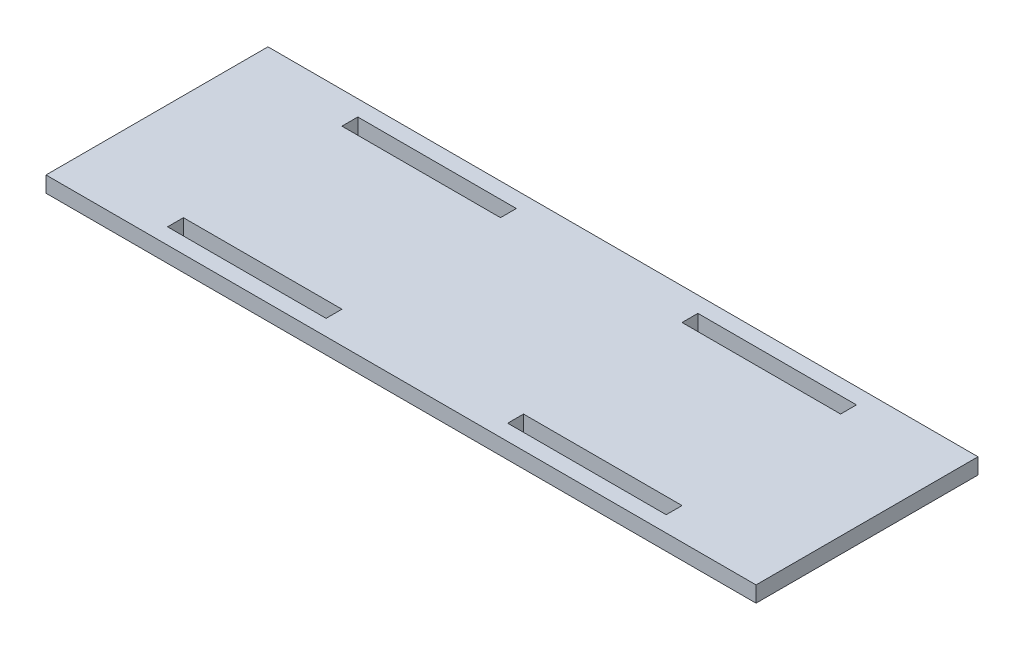
ISO-10303-21;
HEADER;
FILE_DESCRIPTION(('STEP AP214'),'2;1');
FILE_NAME('part.step','',(''),(''),'','','');
FILE_SCHEMA(('AUTOMOTIVE_DESIGN { 1 0 10303 214 1 1 1 1 }'));
ENDSEC;
DATA;
#1=APPLICATION_CONTEXT('core data for automotive mechanical design processes');
#2=APPLICATION_PROTOCOL_DEFINITION('international standard','automotive_design',2000,#1);
#3=PRODUCT_CONTEXT('',#1,'mechanical');
#4=PRODUCT('Part','Part','',(#3));
#5=PRODUCT_RELATED_PRODUCT_CATEGORY('part','',(#4));
#6=PRODUCT_DEFINITION_FORMATION('','',#4);
#7=PRODUCT_DEFINITION_CONTEXT('part definition',#1,'design');
#8=PRODUCT_DEFINITION('design','',#6,#7);
#9=PRODUCT_DEFINITION_SHAPE('','',#8);
#10=(LENGTH_UNIT() NAMED_UNIT(*) SI_UNIT(.MILLI.,.METRE.));
#11=(NAMED_UNIT(*) PLANE_ANGLE_UNIT() SI_UNIT($,.RADIAN.));
#12=(NAMED_UNIT(*) SI_UNIT($,.STERADIAN.) SOLID_ANGLE_UNIT());
#13=UNCERTAINTY_MEASURE_WITH_UNIT(LENGTH_MEASURE(1.E-05),#10,'distance_accuracy_value','');
#14=(GEOMETRIC_REPRESENTATION_CONTEXT(3) GLOBAL_UNCERTAINTY_ASSIGNED_CONTEXT((#13)) GLOBAL_UNIT_ASSIGNED_CONTEXT((#10,
#11,#12)) REPRESENTATION_CONTEXT('',''));
#15=CARTESIAN_POINT('',(0.,0.,0.));
#16=DIRECTION('',(0.,0.,1.));
#17=DIRECTION('',(1.,0.,0.));
#18=AXIS2_PLACEMENT_3D('',#15,#16,#17);
#19=CARTESIAN_POINT('',(0.,3.,0.));
#20=DIRECTION('',(0.,-1.,0.));
#21=DIRECTION('',(0.,0.,-1.));
#22=AXIS2_PLACEMENT_3D('',#19,#20,#21);
#23=PLANE('',#22);
#24=DIRECTION('',(1.,0.,0.));
#25=VECTOR('',#24,1.);
#26=CARTESIAN_POINT('',(84.36,3.,-36.));
#27=LINE('',#26,#25);
#28=CARTESIAN_POINT('',(84.36,3.,-36.));
#29=VERTEX_POINT('',#28);
#30=CARTESIAN_POINT('',(114.36,3.,-36.));
#31=VERTEX_POINT('',#30);
#32=EDGE_CURVE('E208',#29,#31,#27,.T.);
#33=ORIENTED_EDGE('',*,*,#32,.F.);
#34=DIRECTION('',(0.,0.,1.));
#35=VECTOR('',#34,1.);
#36=CARTESIAN_POINT('',(84.36,3.,-36.));
#37=LINE('',#36,#35);
#38=CARTESIAN_POINT('',(84.36,3.,-39.));
#39=VERTEX_POINT('',#38);
#40=EDGE_CURVE('E216',#39,#29,#37,.T.);
#41=ORIENTED_EDGE('',*,*,#40,.F.);
#42=DIRECTION('',(-1.,0.,0.));
#43=VECTOR('',#42,1.);
#44=CARTESIAN_POINT('',(84.36,3.,-39.));
#45=LINE('',#44,#43);
#46=CARTESIAN_POINT('',(114.36,3.,-39.));
#47=VERTEX_POINT('',#46);
#48=EDGE_CURVE('E213',#47,#39,#45,.T.);
#49=ORIENTED_EDGE('',*,*,#48,.F.);
#50=DIRECTION('',(0.,0.,-1.));
#51=VECTOR('',#50,1.);
#52=CARTESIAN_POINT('',(114.36,3.,-36.));
#53=LINE('',#52,#51);
#54=EDGE_CURVE('E210',#31,#47,#53,.T.);
#55=ORIENTED_EDGE('',*,*,#54,.F.);
#56=EDGE_LOOP('',(#33,#41,#49,#55));
#57=FACE_BOUND('',#56,.T.);
#58=DIRECTION('',(0.,0.,1.));
#59=VECTOR('',#58,1.);
#60=CARTESIAN_POINT('',(20.,3.,-6.));
#61=LINE('',#60,#59);
#62=CARTESIAN_POINT('',(20.,3.,-6.));
#63=VERTEX_POINT('',#62);
#64=CARTESIAN_POINT('',(20.,3.,-3.));
#65=VERTEX_POINT('',#64);
#66=EDGE_CURVE('E270',#63,#65,#61,.T.);
#67=ORIENTED_EDGE('',*,*,#66,.F.);
#68=DIRECTION('',(-1.,0.,0.));
#69=VECTOR('',#68,1.);
#70=CARTESIAN_POINT('',(20.,3.,-6.));
#71=LINE('',#70,#69);
#72=CARTESIAN_POINT('',(50.,3.,-6.));
#73=VERTEX_POINT('',#72);
#74=EDGE_CURVE('E278',#73,#63,#71,.T.);
#75=ORIENTED_EDGE('',*,*,#74,.F.);
#76=DIRECTION('',(0.,0.,-1.));
#77=VECTOR('',#76,1.);
#78=CARTESIAN_POINT('',(50.,3.,-6.));
#79=LINE('',#78,#77);
#80=CARTESIAN_POINT('',(50.,3.,-3.));
#81=VERTEX_POINT('',#80);
#82=EDGE_CURVE('E275',#81,#73,#79,.T.);
#83=ORIENTED_EDGE('',*,*,#82,.F.);
#84=DIRECTION('',(1.,0.,0.));
#85=VECTOR('',#84,1.);
#86=CARTESIAN_POINT('',(20.,3.,-3.));
#87=LINE('',#86,#85);
#88=EDGE_CURVE('E272',#65,#81,#87,.T.);
#89=ORIENTED_EDGE('',*,*,#88,.F.);
#90=EDGE_LOOP('',(#67,#75,#83,#89));
#91=FACE_BOUND('',#90,.T.);
#92=DIRECTION('',(0.,0.,1.));
#93=VECTOR('',#92,1.);
#94=CARTESIAN_POINT('',(0.,3.,0.));
#95=LINE('',#94,#93);
#96=CARTESIAN_POINT('',(0.,3.,-42.));
#97=VERTEX_POINT('',#96);
#98=CARTESIAN_POINT('',(0.,3.,0.));
#99=VERTEX_POINT('',#98);
#100=EDGE_CURVE('E301',#97,#99,#95,.T.);
#101=ORIENTED_EDGE('',*,*,#100,.T.);
#102=DIRECTION('',(1.,0.,0.));
#103=VECTOR('',#102,1.);
#104=CARTESIAN_POINT('',(0.,3.,0.));
#105=LINE('',#104,#103);
#106=CARTESIAN_POINT('',(134.36,3.,0.));
#107=VERTEX_POINT('',#106);
#108=EDGE_CURVE('E304',#99,#107,#105,.T.);
#109=ORIENTED_EDGE('',*,*,#108,.T.);
#110=DIRECTION('',(0.,0.,-1.));
#111=VECTOR('',#110,1.);
#112=CARTESIAN_POINT('',(134.36,3.,0.));
#113=LINE('',#112,#111);
#114=CARTESIAN_POINT('',(134.36,3.,-42.));
#115=VERTEX_POINT('',#114);
#116=EDGE_CURVE('E307',#107,#115,#113,.T.);
#117=ORIENTED_EDGE('',*,*,#116,.T.);
#118=DIRECTION('',(-1.,0.,0.));
#119=VECTOR('',#118,1.);
#120=CARTESIAN_POINT('',(0.,3.,-42.));
#121=LINE('',#120,#119);
#122=EDGE_CURVE('E309',#115,#97,#121,.T.);
#123=ORIENTED_EDGE('',*,*,#122,.T.);
#124=EDGE_LOOP('',(#101,#109,#117,#123));
#125=FACE_BOUND('',#124,.T.);
#126=DIRECTION('',(0.,0.,1.));
#127=VECTOR('',#126,1.);
#128=CARTESIAN_POINT('',(84.36,3.,-6.));
#129=LINE('',#128,#127);
#130=CARTESIAN_POINT('',(84.36,3.,-6.));
#131=VERTEX_POINT('',#130);
#132=CARTESIAN_POINT('',(84.36,3.,-3.));
#133=VERTEX_POINT('',#132);
#134=EDGE_CURVE('E239',#131,#133,#129,.T.);
#135=ORIENTED_EDGE('',*,*,#134,.F.);
#136=DIRECTION('',(-1.,0.,0.));
#137=VECTOR('',#136,1.);
#138=CARTESIAN_POINT('',(84.36,3.,-6.));
#139=LINE('',#138,#137);
#140=CARTESIAN_POINT('',(114.36,3.,-6.));
#141=VERTEX_POINT('',#140);
#142=EDGE_CURVE('E247',#141,#131,#139,.T.);
#143=ORIENTED_EDGE('',*,*,#142,.F.);
#144=DIRECTION('',(0.,0.,-1.));
#145=VECTOR('',#144,1.);
#146=CARTESIAN_POINT('',(114.36,3.,-6.));
#147=LINE('',#146,#145);
#148=CARTESIAN_POINT('',(114.36,3.,-3.));
#149=VERTEX_POINT('',#148);
#150=EDGE_CURVE('E244',#149,#141,#147,.T.);
#151=ORIENTED_EDGE('',*,*,#150,.F.);
#152=DIRECTION('',(1.,0.,0.));
#153=VECTOR('',#152,1.);
#154=CARTESIAN_POINT('',(84.36,3.,-3.));
#155=LINE('',#154,#153);
#156=EDGE_CURVE('E241',#133,#149,#155,.T.);
#157=ORIENTED_EDGE('',*,*,#156,.F.);
#158=EDGE_LOOP('',(#135,#143,#151,#157));
#159=FACE_BOUND('',#158,.T.);
#160=DIRECTION('',(1.,0.,0.));
#161=VECTOR('',#160,1.);
#162=CARTESIAN_POINT('',(20.,3.,-36.));
#163=LINE('',#162,#161);
#164=CARTESIAN_POINT('',(20.,3.,-36.));
#165=VERTEX_POINT('',#164);
#166=CARTESIAN_POINT('',(50.,3.,-36.));
#167=VERTEX_POINT('',#166);
#168=EDGE_CURVE('E172',#165,#167,#163,.T.);
#169=ORIENTED_EDGE('',*,*,#168,.F.);
#170=DIRECTION('',(0.,0.,1.));
#171=VECTOR('',#170,1.);
#172=CARTESIAN_POINT('',(20.,3.,-36.));
#173=LINE('',#172,#171);
#174=CARTESIAN_POINT('',(20.,3.,-39.));
#175=VERTEX_POINT('',#174);
#176=EDGE_CURVE('E194',#175,#165,#173,.T.);
#177=ORIENTED_EDGE('',*,*,#176,.F.);
#178=DIRECTION('',(-1.,0.,0.));
#179=VECTOR('',#178,1.);
#180=CARTESIAN_POINT('',(20.,3.,-39.));
#181=LINE('',#180,#179);
#182=CARTESIAN_POINT('',(50.,3.,-39.));
#183=VERTEX_POINT('',#182);
#184=EDGE_CURVE('E192',#183,#175,#181,.T.);
#185=ORIENTED_EDGE('',*,*,#184,.F.);
#186=DIRECTION('',(0.,0.,-1.));
#187=VECTOR('',#186,1.);
#188=CARTESIAN_POINT('',(50.,3.,-36.));
#189=LINE('',#188,#187);
#190=EDGE_CURVE('E180',#167,#183,#189,.T.);
#191=ORIENTED_EDGE('',*,*,#190,.F.);
#192=EDGE_LOOP('',(#169,#177,#185,#191));
#193=FACE_BOUND('',#192,.T.);
#194=ADVANCED_FACE('F35',(#57,#91,#125,#159,#193),#23,.F.);
#195=CARTESIAN_POINT('',(0.,0.,0.));
#196=DIRECTION('',(0.,-1.,0.));
#197=DIRECTION('',(0.,0.,-1.));
#198=AXIS2_PLACEMENT_3D('',#195,#196,#197);
#199=PLANE('',#198);
#200=DIRECTION('',(0.,0.,1.));
#201=VECTOR('',#200,1.);
#202=CARTESIAN_POINT('',(0.,0.,0.));
#203=LINE('',#202,#201);
#204=CARTESIAN_POINT('',(0.,0.,-42.));
#205=VERTEX_POINT('',#204);
#206=CARTESIAN_POINT('',(0.,0.,0.));
#207=VERTEX_POINT('',#206);
#208=EDGE_CURVE('E300',#205,#207,#203,.T.);
#209=ORIENTED_EDGE('',*,*,#208,.F.);
#210=DIRECTION('',(-1.,0.,0.));
#211=VECTOR('',#210,1.);
#212=CARTESIAN_POINT('',(0.,0.,-42.));
#213=LINE('',#212,#211);
#214=CARTESIAN_POINT('',(134.36,0.,-42.));
#215=VERTEX_POINT('',#214);
#216=EDGE_CURVE('E305',#215,#205,#213,.T.);
#217=ORIENTED_EDGE('',*,*,#216,.F.);
#218=DIRECTION('',(0.,0.,-1.));
#219=VECTOR('',#218,1.);
#220=CARTESIAN_POINT('',(134.36,0.,0.));
#221=LINE('',#220,#219);
#222=CARTESIAN_POINT('',(134.36,0.,0.));
#223=VERTEX_POINT('',#222);
#224=EDGE_CURVE('E316',#223,#215,#221,.T.);
#225=ORIENTED_EDGE('',*,*,#224,.F.);
#226=DIRECTION('',(1.,0.,0.));
#227=VECTOR('',#226,1.);
#228=CARTESIAN_POINT('',(0.,0.,0.));
#229=LINE('',#228,#227);
#230=EDGE_CURVE('E314',#207,#223,#229,.T.);
#231=ORIENTED_EDGE('',*,*,#230,.F.);
#232=EDGE_LOOP('',(#209,#217,#225,#231));
#233=FACE_BOUND('',#232,.T.);
#234=DIRECTION('',(-1.,0.,0.));
#235=VECTOR('',#234,1.);
#236=CARTESIAN_POINT('',(20.,0.,-6.));
#237=LINE('',#236,#235);
#238=CARTESIAN_POINT('',(50.,0.,-6.));
#239=VERTEX_POINT('',#238);
#240=CARTESIAN_POINT('',(20.,0.,-6.));
#241=VERTEX_POINT('',#240);
#242=EDGE_CURVE('E273',#239,#241,#237,.T.);
#243=ORIENTED_EDGE('',*,*,#242,.T.);
#244=DIRECTION('',(0.,0.,1.));
#245=VECTOR('',#244,1.);
#246=CARTESIAN_POINT('',(20.,0.,-6.));
#247=LINE('',#246,#245);
#248=CARTESIAN_POINT('',(20.,0.,-3.));
#249=VERTEX_POINT('',#248);
#250=EDGE_CURVE('E269',#241,#249,#247,.T.);
#251=ORIENTED_EDGE('',*,*,#250,.T.);
#252=DIRECTION('',(1.,0.,0.));
#253=VECTOR('',#252,1.);
#254=CARTESIAN_POINT('',(20.,0.,-3.));
#255=LINE('',#254,#253);
#256=CARTESIAN_POINT('',(50.,0.,-3.));
#257=VERTEX_POINT('',#256);
#258=EDGE_CURVE('E283',#249,#257,#255,.T.);
#259=ORIENTED_EDGE('',*,*,#258,.T.);
#260=DIRECTION('',(0.,0.,-1.));
#261=VECTOR('',#260,1.);
#262=CARTESIAN_POINT('',(50.,0.,-6.));
#263=LINE('',#262,#261);
#264=EDGE_CURVE('E286',#257,#239,#263,.T.);
#265=ORIENTED_EDGE('',*,*,#264,.T.);
#266=EDGE_LOOP('',(#243,#251,#259,#265));
#267=FACE_BOUND('',#266,.T.);
#268=DIRECTION('',(-1.,0.,0.));
#269=VECTOR('',#268,1.);
#270=CARTESIAN_POINT('',(84.36,0.,-6.));
#271=LINE('',#270,#269);
#272=CARTESIAN_POINT('',(114.36,0.,-6.));
#273=VERTEX_POINT('',#272);
#274=CARTESIAN_POINT('',(84.36,0.,-6.));
#275=VERTEX_POINT('',#274);
#276=EDGE_CURVE('E242',#273,#275,#271,.T.);
#277=ORIENTED_EDGE('',*,*,#276,.T.);
#278=DIRECTION('',(0.,0.,1.));
#279=VECTOR('',#278,1.);
#280=CARTESIAN_POINT('',(84.36,0.,-6.));
#281=LINE('',#280,#279);
#282=CARTESIAN_POINT('',(84.36,0.,-3.));
#283=VERTEX_POINT('',#282);
#284=EDGE_CURVE('E238',#275,#283,#281,.T.);
#285=ORIENTED_EDGE('',*,*,#284,.T.);
#286=DIRECTION('',(1.,0.,0.));
#287=VECTOR('',#286,1.);
#288=CARTESIAN_POINT('',(84.36,0.,-3.));
#289=LINE('',#288,#287);
#290=CARTESIAN_POINT('',(114.36,0.,-3.));
#291=VERTEX_POINT('',#290);
#292=EDGE_CURVE('E252',#283,#291,#289,.T.);
#293=ORIENTED_EDGE('',*,*,#292,.T.);
#294=DIRECTION('',(0.,0.,-1.));
#295=VECTOR('',#294,1.);
#296=CARTESIAN_POINT('',(114.36,0.,-6.));
#297=LINE('',#296,#295);
#298=EDGE_CURVE('E255',#291,#273,#297,.T.);
#299=ORIENTED_EDGE('',*,*,#298,.T.);
#300=EDGE_LOOP('',(#277,#285,#293,#299));
#301=FACE_BOUND('',#300,.T.);
#302=DIRECTION('',(0.,0.,1.));
#303=VECTOR('',#302,1.);
#304=CARTESIAN_POINT('',(84.36,0.,-36.));
#305=LINE('',#304,#303);
#306=CARTESIAN_POINT('',(84.36,0.,-39.));
#307=VERTEX_POINT('',#306);
#308=CARTESIAN_POINT('',(84.36,0.,-36.));
#309=VERTEX_POINT('',#308);
#310=EDGE_CURVE('E211',#307,#309,#305,.T.);
#311=ORIENTED_EDGE('',*,*,#310,.T.);
#312=DIRECTION('',(1.,0.,0.));
#313=VECTOR('',#312,1.);
#314=CARTESIAN_POINT('',(84.36,0.,-36.));
#315=LINE('',#314,#313);
#316=CARTESIAN_POINT('',(114.36,0.,-36.));
#317=VERTEX_POINT('',#316);
#318=EDGE_CURVE('E188',#309,#317,#315,.T.);
#319=ORIENTED_EDGE('',*,*,#318,.T.);
#320=DIRECTION('',(0.,0.,-1.));
#321=VECTOR('',#320,1.);
#322=CARTESIAN_POINT('',(114.36,0.,-36.));
#323=LINE('',#322,#321);
#324=CARTESIAN_POINT('',(114.36,0.,-39.));
#325=VERTEX_POINT('',#324);
#326=EDGE_CURVE('E221',#317,#325,#323,.T.);
#327=ORIENTED_EDGE('',*,*,#326,.T.);
#328=DIRECTION('',(-1.,0.,0.));
#329=VECTOR('',#328,1.);
#330=CARTESIAN_POINT('',(84.36,0.,-39.));
#331=LINE('',#330,#329);
#332=EDGE_CURVE('E224',#325,#307,#331,.T.);
#333=ORIENTED_EDGE('',*,*,#332,.T.);
#334=EDGE_LOOP('',(#311,#319,#327,#333));
#335=FACE_BOUND('',#334,.T.);
#336=DIRECTION('',(0.,0.,1.));
#337=VECTOR('',#336,1.);
#338=CARTESIAN_POINT('',(20.,0.,-36.));
#339=LINE('',#338,#337);
#340=CARTESIAN_POINT('',(20.,0.,-39.));
#341=VERTEX_POINT('',#340);
#342=CARTESIAN_POINT('',(20.,0.,-36.));
#343=VERTEX_POINT('',#342);
#344=EDGE_CURVE('E181',#341,#343,#339,.T.);
#345=ORIENTED_EDGE('',*,*,#344,.T.);
#346=DIRECTION('',(1.,0.,0.));
#347=VECTOR('',#346,1.);
#348=CARTESIAN_POINT('',(20.,0.,-36.));
#349=LINE('',#348,#347);
#350=CARTESIAN_POINT('',(50.,0.,-36.));
#351=VERTEX_POINT('',#350);
#352=EDGE_CURVE('E58',#343,#351,#349,.T.);
#353=ORIENTED_EDGE('',*,*,#352,.T.);
#354=DIRECTION('',(0.,0.,-1.));
#355=VECTOR('',#354,1.);
#356=CARTESIAN_POINT('',(50.,0.,-36.));
#357=LINE('',#356,#355);
#358=CARTESIAN_POINT('',(50.,0.,-39.));
#359=VERTEX_POINT('',#358);
#360=EDGE_CURVE('E187',#351,#359,#357,.T.);
#361=ORIENTED_EDGE('',*,*,#360,.T.);
#362=DIRECTION('',(-1.,0.,0.));
#363=VECTOR('',#362,1.);
#364=CARTESIAN_POINT('',(20.,0.,-39.));
#365=LINE('',#364,#363);
#366=EDGE_CURVE('E200',#359,#341,#365,.T.);
#367=ORIENTED_EDGE('',*,*,#366,.T.);
#368=EDGE_LOOP('',(#345,#353,#361,#367));
#369=FACE_BOUND('',#368,.T.);
#370=ADVANCED_FACE('F334',(#233,#267,#301,#335,#369),#199,.T.);
#371=CARTESIAN_POINT('',(0.,3.,0.));
#372=DIRECTION('',(1.,0.,0.));
#373=DIRECTION('',(0.,0.,-1.));
#374=AXIS2_PLACEMENT_3D('',#371,#372,#373);
#375=PLANE('',#374);
#376=ORIENTED_EDGE('',*,*,#208,.T.);
#377=DIRECTION('',(0.,-1.,0.));
#378=VECTOR('',#377,1.);
#379=CARTESIAN_POINT('',(0.,3.,0.));
#380=LINE('',#379,#378);
#381=EDGE_CURVE('E11',#99,#207,#380,.T.);
#382=ORIENTED_EDGE('',*,*,#381,.F.);
#383=ORIENTED_EDGE('',*,*,#100,.F.);
#384=DIRECTION('',(0.,-1.,0.));
#385=VECTOR('',#384,1.);
#386=CARTESIAN_POINT('',(0.,3.,-42.));
#387=LINE('',#386,#385);
#388=EDGE_CURVE('E311',#97,#205,#387,.T.);
#389=ORIENTED_EDGE('',*,*,#388,.T.);
#390=EDGE_LOOP('',(#376,#382,#383,#389));
#391=FACE_BOUND('',#390,.T.);
#392=ADVANCED_FACE('F37',(#391),#375,.F.);
#393=CARTESIAN_POINT('',(0.,3.,0.));
#394=DIRECTION('',(0.,0.,-1.));
#395=DIRECTION('',(-1.,0.,0.));
#396=AXIS2_PLACEMENT_3D('',#393,#394,#395);
#397=PLANE('',#396);
#398=ORIENTED_EDGE('',*,*,#230,.T.);
#399=DIRECTION('',(0.,-1.,0.));
#400=VECTOR('',#399,1.);
#401=CARTESIAN_POINT('',(134.36,3.,0.));
#402=LINE('',#401,#400);
#403=EDGE_CURVE('E43',#107,#223,#402,.T.);
#404=ORIENTED_EDGE('',*,*,#403,.F.);
#405=ORIENTED_EDGE('',*,*,#108,.F.);
#406=ORIENTED_EDGE('',*,*,#381,.T.);
#407=EDGE_LOOP('',(#398,#404,#405,#406));
#408=FACE_BOUND('',#407,.T.);
#409=ADVANCED_FACE('F345',(#408),#397,.F.);
#410=CARTESIAN_POINT('',(134.36,3.,0.));
#411=DIRECTION('',(-1.,0.,0.));
#412=DIRECTION('',(0.,0.,1.));
#413=AXIS2_PLACEMENT_3D('',#410,#411,#412);
#414=PLANE('',#413);
#415=ORIENTED_EDGE('',*,*,#224,.T.);
#416=DIRECTION('',(0.,-1.,0.));
#417=VECTOR('',#416,1.);
#418=CARTESIAN_POINT('',(134.36,3.,-42.));
#419=LINE('',#418,#417);
#420=EDGE_CURVE('E321',#115,#215,#419,.T.);
#421=ORIENTED_EDGE('',*,*,#420,.F.);
#422=ORIENTED_EDGE('',*,*,#116,.F.);
#423=ORIENTED_EDGE('',*,*,#403,.T.);
#424=EDGE_LOOP('',(#415,#421,#422,#423));
#425=FACE_BOUND('',#424,.T.);
#426=ADVANCED_FACE('F328',(#425),#414,.F.);
#427=CARTESIAN_POINT('',(0.,3.,-42.));
#428=DIRECTION('',(0.,0.,1.));
#429=DIRECTION('',(1.,0.,0.));
#430=AXIS2_PLACEMENT_3D('',#427,#428,#429);
#431=PLANE('',#430);
#432=ORIENTED_EDGE('',*,*,#216,.T.);
#433=ORIENTED_EDGE('',*,*,#388,.F.);
#434=ORIENTED_EDGE('',*,*,#122,.F.);
#435=ORIENTED_EDGE('',*,*,#420,.T.);
#436=EDGE_LOOP('',(#432,#433,#434,#435));
#437=FACE_BOUND('',#436,.T.);
#438=ADVANCED_FACE('F338',(#437),#431,.F.);
#439=CARTESIAN_POINT('',(20.,3.,-6.));
#440=DIRECTION('',(1.,0.,0.));
#441=DIRECTION('',(0.,0.,-1.));
#442=AXIS2_PLACEMENT_3D('',#439,#440,#441);
#443=PLANE('',#442);
#444=ORIENTED_EDGE('',*,*,#250,.F.);
#445=DIRECTION('',(0.,-1.,0.));
#446=VECTOR('',#445,1.);
#447=CARTESIAN_POINT('',(20.,3.,-6.));
#448=LINE('',#447,#446);
#449=EDGE_CURVE('E280',#63,#241,#448,.T.);
#450=ORIENTED_EDGE('',*,*,#449,.F.);
#451=ORIENTED_EDGE('',*,*,#66,.T.);
#452=DIRECTION('',(0.,-1.,0.));
#453=VECTOR('',#452,1.);
#454=CARTESIAN_POINT('',(20.,3.,-3.));
#455=LINE('',#454,#453);
#456=EDGE_CURVE('E297',#65,#249,#455,.T.);
#457=ORIENTED_EDGE('',*,*,#456,.T.);
#458=EDGE_LOOP('',(#444,#450,#451,#457));
#459=FACE_BOUND('',#458,.T.);
#460=ADVANCED_FACE('F362',(#459),#443,.T.);
#461=CARTESIAN_POINT('',(20.,3.,-3.));
#462=DIRECTION('',(0.,0.,-1.));
#463=DIRECTION('',(-1.,0.,0.));
#464=AXIS2_PLACEMENT_3D('',#461,#462,#463);
#465=PLANE('',#464);
#466=ORIENTED_EDGE('',*,*,#258,.F.);
#467=ORIENTED_EDGE('',*,*,#456,.F.);
#468=ORIENTED_EDGE('',*,*,#88,.T.);
#469=DIRECTION('',(0.,-1.,0.));
#470=VECTOR('',#469,1.);
#471=CARTESIAN_POINT('',(50.,3.,-3.));
#472=LINE('',#471,#470);
#473=EDGE_CURVE('E295',#81,#257,#472,.T.);
#474=ORIENTED_EDGE('',*,*,#473,.T.);
#475=EDGE_LOOP('',(#466,#467,#468,#474));
#476=FACE_BOUND('',#475,.T.);
#477=ADVANCED_FACE('F369',(#476),#465,.T.);
#478=CARTESIAN_POINT('',(50.,3.,-6.));
#479=DIRECTION('',(-1.,0.,0.));
#480=DIRECTION('',(0.,0.,1.));
#481=AXIS2_PLACEMENT_3D('',#478,#479,#480);
#482=PLANE('',#481);
#483=ORIENTED_EDGE('',*,*,#264,.F.);
#484=ORIENTED_EDGE('',*,*,#473,.F.);
#485=ORIENTED_EDGE('',*,*,#82,.T.);
#486=DIRECTION('',(0.,-1.,0.));
#487=VECTOR('',#486,1.);
#488=CARTESIAN_POINT('',(50.,3.,-6.));
#489=LINE('',#488,#487);
#490=EDGE_CURVE('E293',#73,#239,#489,.T.);
#491=ORIENTED_EDGE('',*,*,#490,.T.);
#492=EDGE_LOOP('',(#483,#484,#485,#491));
#493=FACE_BOUND('',#492,.T.);
#494=ADVANCED_FACE('F374',(#493),#482,.T.);
#495=CARTESIAN_POINT('',(20.,3.,-6.));
#496=DIRECTION('',(0.,0.,1.));
#497=DIRECTION('',(1.,0.,0.));
#498=AXIS2_PLACEMENT_3D('',#495,#496,#497);
#499=PLANE('',#498);
#500=ORIENTED_EDGE('',*,*,#242,.F.);
#501=ORIENTED_EDGE('',*,*,#490,.F.);
#502=ORIENTED_EDGE('',*,*,#74,.T.);
#503=ORIENTED_EDGE('',*,*,#449,.T.);
#504=EDGE_LOOP('',(#500,#501,#502,#503));
#505=FACE_BOUND('',#504,.T.);
#506=ADVANCED_FACE('F381',(#505),#499,.T.);
#507=CARTESIAN_POINT('',(84.36,3.,-6.));
#508=DIRECTION('',(1.,0.,0.));
#509=DIRECTION('',(0.,0.,-1.));
#510=AXIS2_PLACEMENT_3D('',#507,#508,#509);
#511=PLANE('',#510);
#512=ORIENTED_EDGE('',*,*,#284,.F.);
#513=DIRECTION('',(0.,-1.,0.));
#514=VECTOR('',#513,1.);
#515=CARTESIAN_POINT('',(84.36,3.,-6.));
#516=LINE('',#515,#514);
#517=EDGE_CURVE('E249',#131,#275,#516,.T.);
#518=ORIENTED_EDGE('',*,*,#517,.F.);
#519=ORIENTED_EDGE('',*,*,#134,.T.);
#520=DIRECTION('',(0.,-1.,0.));
#521=VECTOR('',#520,1.);
#522=CARTESIAN_POINT('',(84.36,3.,-3.));
#523=LINE('',#522,#521);
#524=EDGE_CURVE('E266',#133,#283,#523,.T.);
#525=ORIENTED_EDGE('',*,*,#524,.T.);
#526=EDGE_LOOP('',(#512,#518,#519,#525));
#527=FACE_BOUND('',#526,.T.);
#528=ADVANCED_FACE('F394',(#527),#511,.T.);
#529=CARTESIAN_POINT('',(84.36,3.,-3.));
#530=DIRECTION('',(0.,0.,-1.));
#531=DIRECTION('',(-1.,0.,0.));
#532=AXIS2_PLACEMENT_3D('',#529,#530,#531);
#533=PLANE('',#532);
#534=ORIENTED_EDGE('',*,*,#292,.F.);
#535=ORIENTED_EDGE('',*,*,#524,.F.);
#536=ORIENTED_EDGE('',*,*,#156,.T.);
#537=DIRECTION('',(0.,-1.,0.));
#538=VECTOR('',#537,1.);
#539=CARTESIAN_POINT('',(114.36,3.,-3.));
#540=LINE('',#539,#538);
#541=EDGE_CURVE('E264',#149,#291,#540,.T.);
#542=ORIENTED_EDGE('',*,*,#541,.T.);
#543=EDGE_LOOP('',(#534,#535,#536,#542));
#544=FACE_BOUND('',#543,.T.);
#545=ADVANCED_FACE('F399',(#544),#533,.T.);
#546=CARTESIAN_POINT('',(114.36,3.,-6.));
#547=DIRECTION('',(-1.,0.,0.));
#548=DIRECTION('',(0.,0.,1.));
#549=AXIS2_PLACEMENT_3D('',#546,#547,#548);
#550=PLANE('',#549);
#551=ORIENTED_EDGE('',*,*,#298,.F.);
#552=ORIENTED_EDGE('',*,*,#541,.F.);
#553=ORIENTED_EDGE('',*,*,#150,.T.);
#554=DIRECTION('',(0.,-1.,0.));
#555=VECTOR('',#554,1.);
#556=CARTESIAN_POINT('',(114.36,3.,-6.));
#557=LINE('',#556,#555);
#558=EDGE_CURVE('E262',#141,#273,#557,.T.);
#559=ORIENTED_EDGE('',*,*,#558,.T.);
#560=EDGE_LOOP('',(#551,#552,#553,#559));
#561=FACE_BOUND('',#560,.T.);
#562=ADVANCED_FACE('F403',(#561),#550,.T.);
#563=CARTESIAN_POINT('',(84.36,3.,-6.));
#564=DIRECTION('',(0.,0.,1.));
#565=DIRECTION('',(1.,0.,0.));
#566=AXIS2_PLACEMENT_3D('',#563,#564,#565);
#567=PLANE('',#566);
#568=ORIENTED_EDGE('',*,*,#276,.F.);
#569=ORIENTED_EDGE('',*,*,#558,.F.);
#570=ORIENTED_EDGE('',*,*,#142,.T.);
#571=ORIENTED_EDGE('',*,*,#517,.T.);
#572=EDGE_LOOP('',(#568,#569,#570,#571));
#573=FACE_BOUND('',#572,.T.);
#574=ADVANCED_FACE('F407',(#573),#567,.T.);
#575=CARTESIAN_POINT('',(84.36,3.,-36.));
#576=DIRECTION('',(0.,0.,-1.));
#577=DIRECTION('',(-1.,0.,0.));
#578=AXIS2_PLACEMENT_3D('',#575,#576,#577);
#579=PLANE('',#578);
#580=ORIENTED_EDGE('',*,*,#318,.F.);
#581=DIRECTION('',(0.,-1.,0.));
#582=VECTOR('',#581,1.);
#583=CARTESIAN_POINT('',(84.36,3.,-36.));
#584=LINE('',#583,#582);
#585=EDGE_CURVE('E218',#29,#309,#584,.T.);
#586=ORIENTED_EDGE('',*,*,#585,.F.);
#587=ORIENTED_EDGE('',*,*,#32,.T.);
#588=DIRECTION('',(0.,-1.,0.));
#589=VECTOR('',#588,1.);
#590=CARTESIAN_POINT('',(114.36,3.,-36.));
#591=LINE('',#590,#589);
#592=EDGE_CURVE('E235',#31,#317,#591,.T.);
#593=ORIENTED_EDGE('',*,*,#592,.T.);
#594=EDGE_LOOP('',(#580,#586,#587,#593));
#595=FACE_BOUND('',#594,.T.);
#596=ADVANCED_FACE('F411',(#595),#579,.T.);
#597=CARTESIAN_POINT('',(114.36,3.,-36.));
#598=DIRECTION('',(-1.,0.,0.));
#599=DIRECTION('',(0.,0.,1.));
#600=AXIS2_PLACEMENT_3D('',#597,#598,#599);
#601=PLANE('',#600);
#602=ORIENTED_EDGE('',*,*,#326,.F.);
#603=ORIENTED_EDGE('',*,*,#592,.F.);
#604=ORIENTED_EDGE('',*,*,#54,.T.);
#605=DIRECTION('',(0.,-1.,0.));
#606=VECTOR('',#605,1.);
#607=CARTESIAN_POINT('',(114.36,3.,-39.));
#608=LINE('',#607,#606);
#609=EDGE_CURVE('E233',#47,#325,#608,.T.);
#610=ORIENTED_EDGE('',*,*,#609,.T.);
#611=EDGE_LOOP('',(#602,#603,#604,#610));
#612=FACE_BOUND('',#611,.T.);
#613=ADVANCED_FACE('F415',(#612),#601,.T.);
#614=CARTESIAN_POINT('',(84.36,3.,-39.));
#615=DIRECTION('',(0.,0.,1.));
#616=DIRECTION('',(1.,0.,0.));
#617=AXIS2_PLACEMENT_3D('',#614,#615,#616);
#618=PLANE('',#617);
#619=ORIENTED_EDGE('',*,*,#332,.F.);
#620=ORIENTED_EDGE('',*,*,#609,.F.);
#621=ORIENTED_EDGE('',*,*,#48,.T.);
#622=DIRECTION('',(0.,-1.,0.));
#623=VECTOR('',#622,1.);
#624=CARTESIAN_POINT('',(84.36,3.,-39.));
#625=LINE('',#624,#623);
#626=EDGE_CURVE('E231',#39,#307,#625,.T.);
#627=ORIENTED_EDGE('',*,*,#626,.T.);
#628=EDGE_LOOP('',(#619,#620,#621,#627));
#629=FACE_BOUND('',#628,.T.);
#630=ADVANCED_FACE('F419',(#629),#618,.T.);
#631=CARTESIAN_POINT('',(84.36,3.,-36.));
#632=DIRECTION('',(1.,0.,0.));
#633=DIRECTION('',(0.,0.,-1.));
#634=AXIS2_PLACEMENT_3D('',#631,#632,#633);
#635=PLANE('',#634);
#636=ORIENTED_EDGE('',*,*,#310,.F.);
#637=ORIENTED_EDGE('',*,*,#626,.F.);
#638=ORIENTED_EDGE('',*,*,#40,.T.);
#639=ORIENTED_EDGE('',*,*,#585,.T.);
#640=EDGE_LOOP('',(#636,#637,#638,#639));
#641=FACE_BOUND('',#640,.T.);
#642=ADVANCED_FACE('F423',(#641),#635,.T.);
#643=CARTESIAN_POINT('',(20.,3.,-36.));
#644=DIRECTION('',(0.,0.,-1.));
#645=DIRECTION('',(-1.,0.,0.));
#646=AXIS2_PLACEMENT_3D('',#643,#644,#645);
#647=PLANE('',#646);
#648=ORIENTED_EDGE('',*,*,#352,.F.);
#649=DIRECTION('',(0.,-1.,0.));
#650=VECTOR('',#649,1.);
#651=CARTESIAN_POINT('',(20.,3.,-36.));
#652=LINE('',#651,#650);
#653=EDGE_CURVE('E176',#165,#343,#652,.T.);
#654=ORIENTED_EDGE('',*,*,#653,.F.);
#655=ORIENTED_EDGE('',*,*,#168,.T.);
#656=DIRECTION('',(0.,-1.,0.));
#657=VECTOR('',#656,1.);
#658=CARTESIAN_POINT('',(50.,3.,-36.));
#659=LINE('',#658,#657);
#660=EDGE_CURVE('E175',#167,#351,#659,.T.);
#661=ORIENTED_EDGE('',*,*,#660,.T.);
#662=EDGE_LOOP('',(#648,#654,#655,#661));
#663=FACE_BOUND('',#662,.T.);
#664=ADVANCED_FACE('F174',(#663),#647,.T.);
#665=CARTESIAN_POINT('',(50.,3.,-36.));
#666=DIRECTION('',(-1.,0.,0.));
#667=DIRECTION('',(0.,0.,1.));
#668=AXIS2_PLACEMENT_3D('',#665,#666,#667);
#669=PLANE('',#668);
#670=ORIENTED_EDGE('',*,*,#360,.F.);
#671=ORIENTED_EDGE('',*,*,#660,.F.);
#672=ORIENTED_EDGE('',*,*,#190,.T.);
#673=DIRECTION('',(0.,-1.,0.));
#674=VECTOR('',#673,1.);
#675=CARTESIAN_POINT('',(50.,3.,-39.));
#676=LINE('',#675,#674);
#677=EDGE_CURVE('E189',#183,#359,#676,.T.);
#678=ORIENTED_EDGE('',*,*,#677,.T.);
#679=EDGE_LOOP('',(#670,#671,#672,#678));
#680=FACE_BOUND('',#679,.T.);
#681=ADVANCED_FACE('F184',(#680),#669,.T.);
#682=CARTESIAN_POINT('',(20.,3.,-39.));
#683=DIRECTION('',(0.,0.,1.));
#684=DIRECTION('',(1.,0.,0.));
#685=AXIS2_PLACEMENT_3D('',#682,#683,#684);
#686=PLANE('',#685);
#687=ORIENTED_EDGE('',*,*,#366,.F.);
#688=ORIENTED_EDGE('',*,*,#677,.F.);
#689=ORIENTED_EDGE('',*,*,#184,.T.);
#690=DIRECTION('',(0.,-1.,0.));
#691=VECTOR('',#690,1.);
#692=CARTESIAN_POINT('',(20.,3.,-39.));
#693=LINE('',#692,#691);
#694=EDGE_CURVE('E50',#175,#341,#693,.T.);
#695=ORIENTED_EDGE('',*,*,#694,.T.);
#696=EDGE_LOOP('',(#687,#688,#689,#695));
#697=FACE_BOUND('',#696,.T.);
#698=ADVANCED_FACE('F432',(#697),#686,.T.);
#699=CARTESIAN_POINT('',(20.,3.,-36.));
#700=DIRECTION('',(1.,0.,0.));
#701=DIRECTION('',(0.,0.,-1.));
#702=AXIS2_PLACEMENT_3D('',#699,#700,#701);
#703=PLANE('',#702);
#704=ORIENTED_EDGE('',*,*,#344,.F.);
#705=ORIENTED_EDGE('',*,*,#694,.F.);
#706=ORIENTED_EDGE('',*,*,#176,.T.);
#707=ORIENTED_EDGE('',*,*,#653,.T.);
#708=EDGE_LOOP('',(#704,#705,#706,#707));
#709=FACE_BOUND('',#708,.T.);
#710=ADVANCED_FACE('F435',(#709),#703,.T.);
#711=CLOSED_SHELL('',(#194,#370,#392,#409,#426,#438,#460,#477,#494,#506,#528,#545,#562,#574,
#596,#613,#630,#642,#664,#681,#698,#710));
#712=MANIFOLD_SOLID_BREP('B2',#711);
#713=ADVANCED_BREP_SHAPE_REPRESENTATION('',(#18,#712),#14);
#714=SHAPE_DEFINITION_REPRESENTATION(#9,#713);
ENDSEC;
END-ISO-10303-21;
